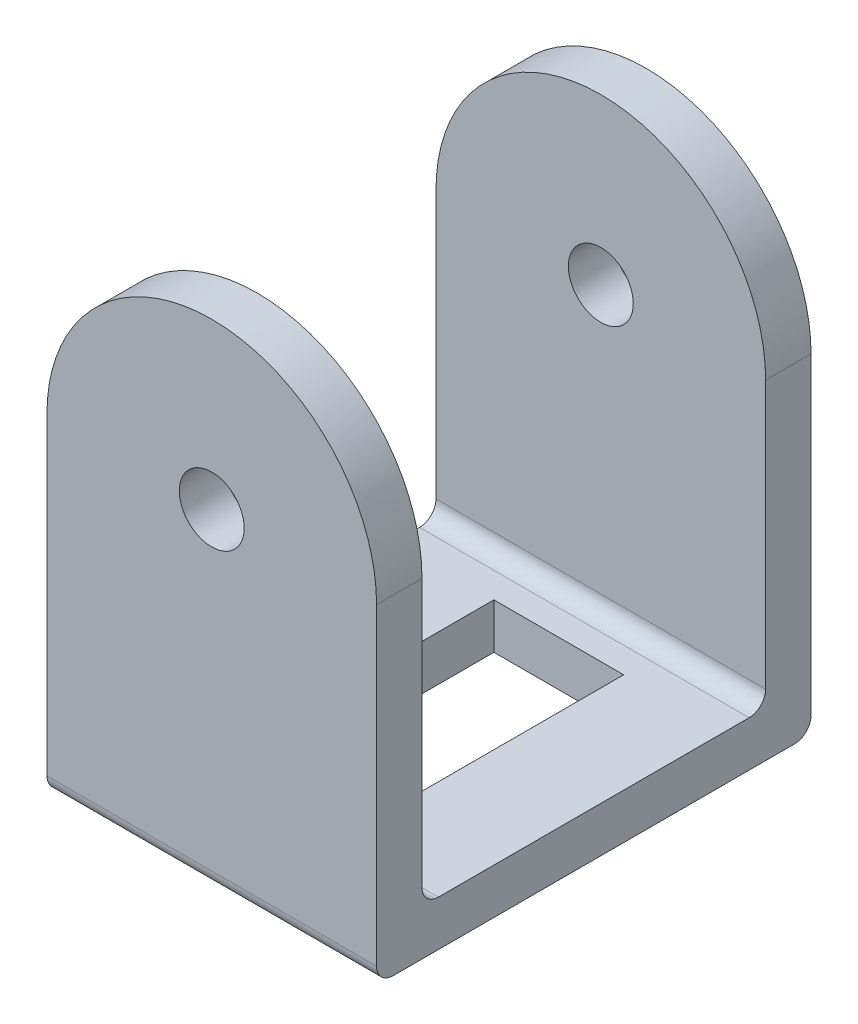
ISO-10303-21;
HEADER;
FILE_DESCRIPTION(('STEP AP214'),'2;1');
FILE_NAME('part.step','',(''),(''),'','','');
FILE_SCHEMA(('AUTOMOTIVE_DESIGN { 1 0 10303 214 1 1 1 1 }'));
ENDSEC;
DATA;
#1=APPLICATION_CONTEXT('core data for automotive mechanical design processes');
#2=APPLICATION_PROTOCOL_DEFINITION('international standard','automotive_design',2000,#1);
#3=PRODUCT_CONTEXT('',#1,'mechanical');
#4=PRODUCT('Part','Part','',(#3));
#5=PRODUCT_RELATED_PRODUCT_CATEGORY('part','',(#4));
#6=PRODUCT_DEFINITION_FORMATION('','',#4);
#7=PRODUCT_DEFINITION_CONTEXT('part definition',#1,'design');
#8=PRODUCT_DEFINITION('design','',#6,#7);
#9=PRODUCT_DEFINITION_SHAPE('','',#8);
#10=(LENGTH_UNIT() NAMED_UNIT(*) SI_UNIT(.MILLI.,.METRE.));
#11=(NAMED_UNIT(*) PLANE_ANGLE_UNIT() SI_UNIT($,.RADIAN.));
#12=(NAMED_UNIT(*) SI_UNIT($,.STERADIAN.) SOLID_ANGLE_UNIT());
#13=UNCERTAINTY_MEASURE_WITH_UNIT(LENGTH_MEASURE(1.E-05),#10,'distance_accuracy_value','');
#14=(GEOMETRIC_REPRESENTATION_CONTEXT(3) GLOBAL_UNCERTAINTY_ASSIGNED_CONTEXT((#13)) GLOBAL_UNIT_ASSIGNED_CONTEXT((#10,
#11,#12)) REPRESENTATION_CONTEXT('',''));
#15=CARTESIAN_POINT('',(0.,0.,0.));
#16=DIRECTION('',(0.,0.,1.));
#17=DIRECTION('',(1.,0.,0.));
#18=AXIS2_PLACEMENT_3D('',#15,#16,#17);
#19=CARTESIAN_POINT('',(0.,50.8,33.48));
#20=DIRECTION('',(0.,0.,1.));
#21=DIRECTION('',(1.,0.,0.));
#22=AXIS2_PLACEMENT_3D('',#19,#20,#21);
#23=CYLINDRICAL_SURFACE('',#22,25.4);
#24=DIRECTION('',(0.,0.,-1.));
#25=VECTOR('',#24,1.);
#26=CARTESIAN_POINT('',(-25.4,50.8,33.48));
#27=LINE('',#26,#25);
#28=CARTESIAN_POINT('',(-25.4,50.8,33.48));
#29=VERTEX_POINT('',#28);
#30=CARTESIAN_POINT('',(-25.4,50.8,26.48));
#31=VERTEX_POINT('',#30);
#32=EDGE_CURVE('E266',#29,#31,#27,.T.);
#33=ORIENTED_EDGE('',*,*,#32,.F.);
#34=CARTESIAN_POINT('',(0.,50.8,33.48));
#35=DIRECTION('',(0.,0.,-1.));
#36=DIRECTION('',(-1.,0.,0.));
#37=AXIS2_PLACEMENT_3D('',#34,#35,#36);
#38=CIRCLE('',#37,25.4);
#39=CARTESIAN_POINT('',(25.4,50.8,33.48));
#40=VERTEX_POINT('',#39);
#41=EDGE_CURVE('E274',#40,#29,#38,.F.);
#42=ORIENTED_EDGE('',*,*,#41,.F.);
#43=DIRECTION('',(0.,0.,-1.));
#44=VECTOR('',#43,1.);
#45=CARTESIAN_POINT('',(25.4,50.8,33.48));
#46=LINE('',#45,#44);
#47=CARTESIAN_POINT('',(25.4,50.8,26.48));
#48=VERTEX_POINT('',#47);
#49=EDGE_CURVE('E270',#48,#40,#46,.F.);
#50=ORIENTED_EDGE('',*,*,#49,.F.);
#51=CARTESIAN_POINT('',(0.,50.8,26.48));
#52=DIRECTION('',(0.,0.,1.));
#53=DIRECTION('',(1.,0.,0.));
#54=AXIS2_PLACEMENT_3D('',#51,#52,#53);
#55=CIRCLE('',#54,25.4);
#56=EDGE_CURVE('E277',#31,#48,#55,.F.);
#57=ORIENTED_EDGE('',*,*,#56,.F.);
#58=EDGE_LOOP('',(#33,#42,#50,#57));
#59=FACE_BOUND('',#58,.T.);
#60=ADVANCED_FACE('F47',(#59),#23,.T.);
#61=CARTESIAN_POINT('',(0.,50.8,-26.48));
#62=DIRECTION('',(0.,0.,1.));
#63=DIRECTION('',(1.,0.,0.));
#64=AXIS2_PLACEMENT_3D('',#61,#62,#63);
#65=CYLINDRICAL_SURFACE('',#64,25.4);
#66=DIRECTION('',(0.,0.,-1.));
#67=VECTOR('',#66,1.);
#68=CARTESIAN_POINT('',(-25.4,50.8,-26.48));
#69=LINE('',#68,#67);
#70=CARTESIAN_POINT('',(-25.4,50.8,-26.48));
#71=VERTEX_POINT('',#70);
#72=CARTESIAN_POINT('',(-25.4,50.8,-33.48));
#73=VERTEX_POINT('',#72);
#74=EDGE_CURVE('E252',#71,#73,#69,.T.);
#75=ORIENTED_EDGE('',*,*,#74,.F.);
#76=CARTESIAN_POINT('',(0.,50.8,-26.48));
#77=DIRECTION('',(0.,0.,-1.));
#78=DIRECTION('',(-1.,0.,0.));
#79=AXIS2_PLACEMENT_3D('',#76,#77,#78);
#80=CIRCLE('',#79,25.4);
#81=CARTESIAN_POINT('',(25.4,50.8,-26.48));
#82=VERTEX_POINT('',#81);
#83=EDGE_CURVE('E260',#82,#71,#80,.F.);
#84=ORIENTED_EDGE('',*,*,#83,.F.);
#85=DIRECTION('',(0.,0.,-1.));
#86=VECTOR('',#85,1.);
#87=CARTESIAN_POINT('',(25.4,50.8,-26.48));
#88=LINE('',#87,#86);
#89=CARTESIAN_POINT('',(25.4,50.8,-33.48));
#90=VERTEX_POINT('',#89);
#91=EDGE_CURVE('E256',#90,#82,#88,.F.);
#92=ORIENTED_EDGE('',*,*,#91,.F.);
#93=CARTESIAN_POINT('',(0.,50.8,-33.48));
#94=DIRECTION('',(0.,0.,1.));
#95=DIRECTION('',(1.,0.,0.));
#96=AXIS2_PLACEMENT_3D('',#93,#94,#95);
#97=CIRCLE('',#96,25.4);
#98=EDGE_CURVE('E263',#73,#90,#97,.F.);
#99=ORIENTED_EDGE('',*,*,#98,.F.);
#100=EDGE_LOOP('',(#75,#84,#92,#99));
#101=FACE_BOUND('',#100,.T.);
#102=ADVANCED_FACE('F421',(#101),#65,.T.);
#103=CARTESIAN_POINT('',(0.,7.,0.));
#104=DIRECTION('',(0.,1.,0.));
#105=DIRECTION('',(0.,0.,1.));
#106=AXIS2_PLACEMENT_3D('',#103,#104,#105);
#107=PLANE('',#106);
#108=DIRECTION('',(0.,0.,1.));
#109=VECTOR('',#108,1.);
#110=CARTESIAN_POINT('',(-10.,7.,20.));
#111=LINE('',#110,#109);
#112=CARTESIAN_POINT('',(-10.,7.,-20.));
#113=VERTEX_POINT('',#112);
#114=CARTESIAN_POINT('',(-10.,7.,20.));
#115=VERTEX_POINT('',#114);
#116=EDGE_CURVE('E168',#113,#115,#111,.T.);
#117=ORIENTED_EDGE('',*,*,#116,.F.);
#118=DIRECTION('',(-1.,0.,0.));
#119=VECTOR('',#118,1.);
#120=CARTESIAN_POINT('',(10.,7.,-20.));
#121=LINE('',#120,#119);
#122=CARTESIAN_POINT('',(10.,7.,-20.));
#123=VERTEX_POINT('',#122);
#124=EDGE_CURVE('E189',#123,#113,#121,.T.);
#125=ORIENTED_EDGE('',*,*,#124,.F.);
#126=DIRECTION('',(0.,0.,-1.));
#127=VECTOR('',#126,1.);
#128=CARTESIAN_POINT('',(10.,7.,20.));
#129=LINE('',#128,#127);
#130=CARTESIAN_POINT('',(10.,7.,20.));
#131=VERTEX_POINT('',#130);
#132=EDGE_CURVE('E194',#131,#123,#129,.T.);
#133=ORIENTED_EDGE('',*,*,#132,.F.);
#134=DIRECTION('',(1.,0.,0.));
#135=VECTOR('',#134,1.);
#136=CARTESIAN_POINT('',(10.,7.,20.));
#137=LINE('',#136,#135);
#138=EDGE_CURVE('E206',#115,#131,#137,.T.);
#139=ORIENTED_EDGE('',*,*,#138,.F.);
#140=EDGE_LOOP('',(#117,#125,#133,#139));
#141=FACE_BOUND('',#140,.T.);
#142=DIRECTION('',(0.,0.,1.));
#143=VECTOR('',#142,1.);
#144=CARTESIAN_POINT('',(-25.4,7.,33.48));
#145=LINE('',#144,#143);
#146=CARTESIAN_POINT('',(-25.4,7.,-23.94));
#147=VERTEX_POINT('',#146);
#148=CARTESIAN_POINT('',(-25.4,7.,23.94));
#149=VERTEX_POINT('',#148);
#150=EDGE_CURVE('E221',#147,#149,#145,.T.);
#151=ORIENTED_EDGE('',*,*,#150,.T.);
#152=DIRECTION('',(-1.,0.,0.));
#153=VECTOR('',#152,1.);
#154=CARTESIAN_POINT('',(0.,7.,23.94));
#155=LINE('',#154,#153);
#156=CARTESIAN_POINT('',(25.4,7.,23.94));
#157=VERTEX_POINT('',#156);
#158=EDGE_CURVE('E292',#149,#157,#155,.F.);
#159=ORIENTED_EDGE('',*,*,#158,.T.);
#160=DIRECTION('',(0.,0.,-1.));
#161=VECTOR('',#160,1.);
#162=CARTESIAN_POINT('',(25.4,7.,33.48));
#163=LINE('',#162,#161);
#164=CARTESIAN_POINT('',(25.4,7.,-23.94));
#165=VERTEX_POINT('',#164);
#166=EDGE_CURVE('E225',#157,#165,#163,.T.);
#167=ORIENTED_EDGE('',*,*,#166,.T.);
#168=DIRECTION('',(1.,0.,0.));
#169=VECTOR('',#168,1.);
#170=CARTESIAN_POINT('',(0.,7.,-23.94));
#171=LINE('',#170,#169);
#172=EDGE_CURVE('E289',#165,#147,#171,.F.);
#173=ORIENTED_EDGE('',*,*,#172,.T.);
#174=EDGE_LOOP('',(#151,#159,#167,#173));
#175=FACE_BOUND('',#174,.T.);
#176=ADVANCED_FACE('F337',(#141,#175),#107,.T.);
#177=CARTESIAN_POINT('',(-25.4,7.,33.48));
#178=DIRECTION('',(1.,0.,0.));
#179=DIRECTION('',(0.,0.,-1.));
#180=AXIS2_PLACEMENT_3D('',#177,#178,#179);
#181=PLANE('',#180);
#182=DIRECTION('',(0.,-1.,0.));
#183=VECTOR('',#182,1.);
#184=CARTESIAN_POINT('',(-25.4,7.,-33.48));
#185=LINE('',#184,#183);
#186=CARTESIAN_POINT('',(-25.4,2.54,-33.48));
#187=VERTEX_POINT('',#186);
#188=EDGE_CURVE('E230',#73,#187,#185,.T.);
#189=ORIENTED_EDGE('',*,*,#188,.T.);
#190=CARTESIAN_POINT('',(-25.4,2.54,-30.94));
#191=DIRECTION('',(1.,0.,0.));
#192=DIRECTION('',(0.,0.,-1.));
#193=AXIS2_PLACEMENT_3D('',#190,#191,#192);
#194=CIRCLE('',#193,2.54);
#195=CARTESIAN_POINT('',(-25.4,0.,-30.94));
#196=VERTEX_POINT('',#195);
#197=EDGE_CURVE('E302',#187,#196,#194,.F.);
#198=ORIENTED_EDGE('',*,*,#197,.T.);
#199=DIRECTION('',(0.,0.,1.));
#200=VECTOR('',#199,1.);
#201=CARTESIAN_POINT('',(-25.4,0.,33.48));
#202=LINE('',#201,#200);
#203=CARTESIAN_POINT('',(-25.4,0.,30.94));
#204=VERTEX_POINT('',#203);
#205=EDGE_CURVE('E215',#196,#204,#202,.T.);
#206=ORIENTED_EDGE('',*,*,#205,.T.);
#207=CARTESIAN_POINT('',(-25.4,2.54,30.94));
#208=DIRECTION('',(1.,0.,0.));
#209=DIRECTION('',(0.,0.,-1.));
#210=AXIS2_PLACEMENT_3D('',#207,#208,#209);
#211=CIRCLE('',#210,2.54);
#212=CARTESIAN_POINT('',(-25.4,2.54,33.48));
#213=VERTEX_POINT('',#212);
#214=EDGE_CURVE('E299',#204,#213,#211,.F.);
#215=ORIENTED_EDGE('',*,*,#214,.T.);
#216=DIRECTION('',(0.,-1.,0.));
#217=VECTOR('',#216,1.);
#218=CARTESIAN_POINT('',(-25.4,7.,33.48));
#219=LINE('',#218,#217);
#220=EDGE_CURVE('E248',#29,#213,#219,.T.);
#221=ORIENTED_EDGE('',*,*,#220,.F.);
#222=ORIENTED_EDGE('',*,*,#32,.T.);
#223=DIRECTION('',(0.,-1.,0.));
#224=VECTOR('',#223,1.);
#225=CARTESIAN_POINT('',(-25.4,76.2,26.48));
#226=LINE('',#225,#224);
#227=CARTESIAN_POINT('',(-25.4,9.54000000000001,26.48));
#228=VERTEX_POINT('',#227);
#229=EDGE_CURVE('E351',#31,#228,#226,.T.);
#230=ORIENTED_EDGE('',*,*,#229,.T.);
#231=CARTESIAN_POINT('',(-25.4,9.54000000000001,23.94));
#232=DIRECTION('',(1.,0.,0.));
#233=DIRECTION('',(0.,0.,-1.));
#234=AXIS2_PLACEMENT_3D('',#231,#232,#233);
#235=CIRCLE('',#234,2.54);
#236=EDGE_CURVE('E322',#228,#149,#235,.T.);
#237=ORIENTED_EDGE('',*,*,#236,.T.);
#238=ORIENTED_EDGE('',*,*,#150,.F.);
#239=CARTESIAN_POINT('',(-25.4,9.54000000000001,-23.94));
#240=DIRECTION('',(1.,0.,0.));
#241=DIRECTION('',(0.,0.,-1.));
#242=AXIS2_PLACEMENT_3D('',#239,#240,#241);
#243=CIRCLE('',#242,2.54);
#244=CARTESIAN_POINT('',(-25.4,9.54000000000001,-26.48));
#245=VERTEX_POINT('',#244);
#246=EDGE_CURVE('E11',#147,#245,#243,.T.);
#247=ORIENTED_EDGE('',*,*,#246,.T.);
#248=DIRECTION('',(0.,-1.,0.));
#249=VECTOR('',#248,1.);
#250=CARTESIAN_POINT('',(-25.4,76.2,-26.48));
#251=LINE('',#250,#249);
#252=EDGE_CURVE('E197',#71,#245,#251,.T.);
#253=ORIENTED_EDGE('',*,*,#252,.F.);
#254=ORIENTED_EDGE('',*,*,#74,.T.);
#255=EDGE_LOOP('',(#189,#198,#206,#215,#221,#222,#230,#237,#238,#247,#253,#254));
#256=FACE_BOUND('',#255,.T.);
#257=ADVANCED_FACE('F344',(#256),#181,.F.);
#258=CARTESIAN_POINT('',(25.4,7.,33.48));
#259=DIRECTION('',(0.,0.,-1.));
#260=DIRECTION('',(-1.,0.,0.));
#261=AXIS2_PLACEMENT_3D('',#258,#259,#260);
#262=PLANE('',#261);
#263=CARTESIAN_POINT('',(0.,50.8,33.48));
#264=DIRECTION('',(0.,0.,-1.));
#265=DIRECTION('',(-1.,0.,0.));
#266=AXIS2_PLACEMENT_3D('',#263,#264,#265);
#267=CIRCLE('',#266,5.);
#268=CARTESIAN_POINT('',(-5.,50.8,33.48));
#269=VERTEX_POINT('',#268);
#270=EDGE_CURVE('E361',#269,#269,#267,.T.);
#271=ORIENTED_EDGE('',*,*,#270,.T.);
#272=EDGE_LOOP('',(#271));
#273=FACE_BOUND('',#272,.T.);
#274=ORIENTED_EDGE('',*,*,#220,.T.);
#275=DIRECTION('',(1.,0.,0.));
#276=VECTOR('',#275,1.);
#277=CARTESIAN_POINT('',(25.4,2.54,33.48));
#278=LINE('',#277,#276);
#279=CARTESIAN_POINT('',(25.4,2.54,33.48));
#280=VERTEX_POINT('',#279);
#281=EDGE_CURVE('E316',#213,#280,#278,.T.);
#282=ORIENTED_EDGE('',*,*,#281,.T.);
#283=DIRECTION('',(0.,-1.,0.));
#284=VECTOR('',#283,1.);
#285=CARTESIAN_POINT('',(25.4,7.,33.48));
#286=LINE('',#285,#284);
#287=EDGE_CURVE('E244',#40,#280,#286,.T.);
#288=ORIENTED_EDGE('',*,*,#287,.F.);
#289=ORIENTED_EDGE('',*,*,#41,.T.);
#290=EDGE_LOOP('',(#274,#282,#288,#289));
#291=FACE_BOUND('',#290,.T.);
#292=ADVANCED_FACE('F401',(#273,#291),#262,.F.);
#293=CARTESIAN_POINT('',(25.4,7.,33.48));
#294=DIRECTION('',(-1.,0.,0.));
#295=DIRECTION('',(0.,0.,1.));
#296=AXIS2_PLACEMENT_3D('',#293,#294,#295);
#297=PLANE('',#296);
#298=DIRECTION('',(0.,0.,-1.));
#299=VECTOR('',#298,1.);
#300=CARTESIAN_POINT('',(25.4,0.,33.48));
#301=LINE('',#300,#299);
#302=CARTESIAN_POINT('',(25.4,0.,30.94));
#303=VERTEX_POINT('',#302);
#304=CARTESIAN_POINT('',(25.4,0.,-30.94));
#305=VERTEX_POINT('',#304);
#306=EDGE_CURVE('E226',#303,#305,#301,.T.);
#307=ORIENTED_EDGE('',*,*,#306,.T.);
#308=CARTESIAN_POINT('',(25.4,2.54,-30.94));
#309=DIRECTION('',(-1.,0.,0.));
#310=DIRECTION('',(0.,0.,1.));
#311=AXIS2_PLACEMENT_3D('',#308,#309,#310);
#312=CIRCLE('',#311,2.54);
#313=CARTESIAN_POINT('',(25.4,2.54,-33.48));
#314=VERTEX_POINT('',#313);
#315=EDGE_CURVE('E313',#305,#314,#312,.F.);
#316=ORIENTED_EDGE('',*,*,#315,.T.);
#317=DIRECTION('',(0.,-1.,0.));
#318=VECTOR('',#317,1.);
#319=CARTESIAN_POINT('',(25.4,7.,-33.48));
#320=LINE('',#319,#318);
#321=EDGE_CURVE('E240',#90,#314,#320,.T.);
#322=ORIENTED_EDGE('',*,*,#321,.F.);
#323=ORIENTED_EDGE('',*,*,#91,.T.);
#324=DIRECTION('',(0.,-1.,0.));
#325=VECTOR('',#324,1.);
#326=CARTESIAN_POINT('',(25.4,76.2,-26.48));
#327=LINE('',#326,#325);
#328=CARTESIAN_POINT('',(25.4,9.54000000000001,-26.48));
#329=VERTEX_POINT('',#328);
#330=EDGE_CURVE('E335',#82,#329,#327,.T.);
#331=ORIENTED_EDGE('',*,*,#330,.T.);
#332=CARTESIAN_POINT('',(25.4,9.54000000000001,-23.94));
#333=DIRECTION('',(-1.,0.,0.));
#334=DIRECTION('',(0.,0.,1.));
#335=AXIS2_PLACEMENT_3D('',#332,#333,#334);
#336=CIRCLE('',#335,2.54);
#337=EDGE_CURVE('E56',#329,#165,#336,.T.);
#338=ORIENTED_EDGE('',*,*,#337,.T.);
#339=ORIENTED_EDGE('',*,*,#166,.F.);
#340=CARTESIAN_POINT('',(25.4,9.54000000000001,23.94));
#341=DIRECTION('',(-1.,0.,0.));
#342=DIRECTION('',(0.,0.,1.));
#343=AXIS2_PLACEMENT_3D('',#340,#341,#342);
#344=CIRCLE('',#343,2.54);
#345=CARTESIAN_POINT('',(25.4,9.54000000000001,26.48));
#346=VERTEX_POINT('',#345);
#347=EDGE_CURVE('E325',#157,#346,#344,.T.);
#348=ORIENTED_EDGE('',*,*,#347,.T.);
#349=DIRECTION('',(0.,-1.,0.));
#350=VECTOR('',#349,1.);
#351=CARTESIAN_POINT('',(25.4,76.2,26.48));
#352=LINE('',#351,#350);
#353=EDGE_CURVE('E355',#48,#346,#352,.T.);
#354=ORIENTED_EDGE('',*,*,#353,.F.);
#355=ORIENTED_EDGE('',*,*,#49,.T.);
#356=ORIENTED_EDGE('',*,*,#287,.T.);
#357=CARTESIAN_POINT('',(25.4,2.54,30.94));
#358=DIRECTION('',(-1.,0.,0.));
#359=DIRECTION('',(0.,0.,1.));
#360=AXIS2_PLACEMENT_3D('',#357,#358,#359);
#361=CIRCLE('',#360,2.54);
#362=EDGE_CURVE('E70',#280,#303,#361,.F.);
#363=ORIENTED_EDGE('',*,*,#362,.T.);
#364=EDGE_LOOP('',(#307,#316,#322,#323,#331,#338,#339,#348,#354,#355,#356,#363));
#365=FACE_BOUND('',#364,.T.);
#366=ADVANCED_FACE('F332',(#365),#297,.F.);
#367=CARTESIAN_POINT('',(25.4,7.,-33.48));
#368=DIRECTION('',(0.,0.,1.));
#369=DIRECTION('',(1.,0.,0.));
#370=AXIS2_PLACEMENT_3D('',#367,#368,#369);
#371=PLANE('',#370);
#372=CARTESIAN_POINT('',(0.,50.8,-33.48));
#373=DIRECTION('',(0.,0.,1.));
#374=DIRECTION('',(1.,0.,0.));
#375=AXIS2_PLACEMENT_3D('',#372,#373,#374);
#376=CIRCLE('',#375,5.);
#377=CARTESIAN_POINT('',(5.,50.8,-33.48));
#378=VERTEX_POINT('',#377);
#379=EDGE_CURVE('E365',#378,#378,#376,.T.);
#380=ORIENTED_EDGE('',*,*,#379,.T.);
#381=EDGE_LOOP('',(#380));
#382=FACE_BOUND('',#381,.T.);
#383=ORIENTED_EDGE('',*,*,#321,.T.);
#384=DIRECTION('',(-1.,0.,0.));
#385=VECTOR('',#384,1.);
#386=CARTESIAN_POINT('',(25.4,2.54,-33.48));
#387=LINE('',#386,#385);
#388=EDGE_CURVE('E295',#314,#187,#387,.T.);
#389=ORIENTED_EDGE('',*,*,#388,.T.);
#390=ORIENTED_EDGE('',*,*,#188,.F.);
#391=ORIENTED_EDGE('',*,*,#98,.T.);
#392=EDGE_LOOP('',(#383,#389,#390,#391));
#393=FACE_BOUND('',#392,.T.);
#394=ADVANCED_FACE('F383',(#382,#393),#371,.F.);
#395=CARTESIAN_POINT('',(0.,0.,0.));
#396=DIRECTION('',(0.,1.,0.));
#397=DIRECTION('',(0.,0.,1.));
#398=AXIS2_PLACEMENT_3D('',#395,#396,#397);
#399=PLANE('',#398);
#400=DIRECTION('',(-1.,0.,0.));
#401=VECTOR('',#400,1.);
#402=CARTESIAN_POINT('',(10.,0.,-20.));
#403=LINE('',#402,#401);
#404=CARTESIAN_POINT('',(10.,0.,-20.));
#405=VERTEX_POINT('',#404);
#406=CARTESIAN_POINT('',(-10.,0.,-20.));
#407=VERTEX_POINT('',#406);
#408=EDGE_CURVE('E174',#405,#407,#403,.T.);
#409=ORIENTED_EDGE('',*,*,#408,.T.);
#410=DIRECTION('',(0.,0.,1.));
#411=VECTOR('',#410,1.);
#412=CARTESIAN_POINT('',(-10.,0.,20.));
#413=LINE('',#412,#411);
#414=CARTESIAN_POINT('',(-10.,0.,20.));
#415=VERTEX_POINT('',#414);
#416=EDGE_CURVE('E165',#407,#415,#413,.T.);
#417=ORIENTED_EDGE('',*,*,#416,.T.);
#418=DIRECTION('',(1.,0.,0.));
#419=VECTOR('',#418,1.);
#420=CARTESIAN_POINT('',(10.,0.,20.));
#421=LINE('',#420,#419);
#422=CARTESIAN_POINT('',(10.,0.,20.));
#423=VERTEX_POINT('',#422);
#424=EDGE_CURVE('E178',#415,#423,#421,.T.);
#425=ORIENTED_EDGE('',*,*,#424,.T.);
#426=DIRECTION('',(0.,0.,-1.));
#427=VECTOR('',#426,1.);
#428=CARTESIAN_POINT('',(10.,0.,20.));
#429=LINE('',#428,#427);
#430=EDGE_CURVE('E183',#423,#405,#429,.T.);
#431=ORIENTED_EDGE('',*,*,#430,.T.);
#432=EDGE_LOOP('',(#409,#417,#425,#431));
#433=FACE_BOUND('',#432,.T.);
#434=ORIENTED_EDGE('',*,*,#205,.F.);
#435=DIRECTION('',(-1.,0.,0.));
#436=VECTOR('',#435,1.);
#437=CARTESIAN_POINT('',(0.,0.,-30.94));
#438=LINE('',#437,#436);
#439=EDGE_CURVE('E308',#196,#305,#438,.F.);
#440=ORIENTED_EDGE('',*,*,#439,.T.);
#441=ORIENTED_EDGE('',*,*,#306,.F.);
#442=DIRECTION('',(1.,0.,0.));
#443=VECTOR('',#442,1.);
#444=CARTESIAN_POINT('',(0.,0.,30.94));
#445=LINE('',#444,#443);
#446=EDGE_CURVE('E305',#303,#204,#445,.F.);
#447=ORIENTED_EDGE('',*,*,#446,.T.);
#448=EDGE_LOOP('',(#434,#440,#441,#447));
#449=FACE_BOUND('',#448,.T.);
#450=ADVANCED_FACE('F185',(#433,#449),#399,.F.);
#451=CARTESIAN_POINT('',(-10.,0.,20.));
#452=DIRECTION('',(-1.,0.,0.));
#453=DIRECTION('',(0.,0.,1.));
#454=AXIS2_PLACEMENT_3D('',#451,#452,#453);
#455=PLANE('',#454);
#456=ORIENTED_EDGE('',*,*,#116,.T.);
#457=DIRECTION('',(0.,1.,0.));
#458=VECTOR('',#457,1.);
#459=CARTESIAN_POINT('',(-10.,0.,20.));
#460=LINE('',#459,#458);
#461=EDGE_CURVE('E161',#415,#115,#460,.T.);
#462=ORIENTED_EDGE('',*,*,#461,.F.);
#463=ORIENTED_EDGE('',*,*,#416,.F.);
#464=DIRECTION('',(0.,1.,0.));
#465=VECTOR('',#464,1.);
#466=CARTESIAN_POINT('',(-10.,0.,-20.));
#467=LINE('',#466,#465);
#468=EDGE_CURVE('E212',#407,#113,#467,.T.);
#469=ORIENTED_EDGE('',*,*,#468,.T.);
#470=EDGE_LOOP('',(#456,#462,#463,#469));
#471=FACE_BOUND('',#470,.T.);
#472=ADVANCED_FACE('F163',(#471),#455,.F.);
#473=CARTESIAN_POINT('',(10.,0.,-20.));
#474=DIRECTION('',(0.,0.,-1.));
#475=DIRECTION('',(-1.,0.,0.));
#476=AXIS2_PLACEMENT_3D('',#473,#474,#475);
#477=PLANE('',#476);
#478=ORIENTED_EDGE('',*,*,#124,.T.);
#479=ORIENTED_EDGE('',*,*,#468,.F.);
#480=ORIENTED_EDGE('',*,*,#408,.F.);
#481=DIRECTION('',(0.,1.,0.));
#482=VECTOR('',#481,1.);
#483=CARTESIAN_POINT('',(10.,0.,-20.));
#484=LINE('',#483,#482);
#485=EDGE_CURVE('E216',#405,#123,#484,.T.);
#486=ORIENTED_EDGE('',*,*,#485,.T.);
#487=EDGE_LOOP('',(#478,#479,#480,#486));
#488=FACE_BOUND('',#487,.T.);
#489=ADVANCED_FACE('F449',(#488),#477,.F.);
#490=CARTESIAN_POINT('',(10.,0.,20.));
#491=DIRECTION('',(1.,0.,0.));
#492=DIRECTION('',(0.,0.,-1.));
#493=AXIS2_PLACEMENT_3D('',#490,#491,#492);
#494=PLANE('',#493);
#495=ORIENTED_EDGE('',*,*,#132,.T.);
#496=ORIENTED_EDGE('',*,*,#485,.F.);
#497=ORIENTED_EDGE('',*,*,#430,.F.);
#498=DIRECTION('',(0.,1.,0.));
#499=VECTOR('',#498,1.);
#500=CARTESIAN_POINT('',(10.,0.,20.));
#501=LINE('',#500,#499);
#502=EDGE_CURVE('E173',#423,#131,#501,.T.);
#503=ORIENTED_EDGE('',*,*,#502,.T.);
#504=EDGE_LOOP('',(#495,#496,#497,#503));
#505=FACE_BOUND('',#504,.T.);
#506=ADVANCED_FACE('F452',(#505),#494,.F.);
#507=CARTESIAN_POINT('',(10.,0.,20.));
#508=DIRECTION('',(0.,0.,1.));
#509=DIRECTION('',(1.,0.,0.));
#510=AXIS2_PLACEMENT_3D('',#507,#508,#509);
#511=PLANE('',#510);
#512=ORIENTED_EDGE('',*,*,#138,.T.);
#513=ORIENTED_EDGE('',*,*,#502,.F.);
#514=ORIENTED_EDGE('',*,*,#424,.F.);
#515=ORIENTED_EDGE('',*,*,#461,.T.);
#516=EDGE_LOOP('',(#512,#513,#514,#515));
#517=FACE_BOUND('',#516,.T.);
#518=ADVANCED_FACE('F179',(#517),#511,.F.);
#519=CARTESIAN_POINT('',(-25.4,76.2,-26.48));
#520=DIRECTION('',(0.,0.,-1.));
#521=DIRECTION('',(-1.,0.,0.));
#522=AXIS2_PLACEMENT_3D('',#519,#520,#521);
#523=PLANE('',#522);
#524=CARTESIAN_POINT('',(0.,50.8,-26.48));
#525=DIRECTION('',(0.,0.,-1.));
#526=DIRECTION('',(-1.,0.,0.));
#527=AXIS2_PLACEMENT_3D('',#524,#525,#526);
#528=CIRCLE('',#527,5.);
#529=CARTESIAN_POINT('',(-5.,50.8,-26.48));
#530=VERTEX_POINT('',#529);
#531=EDGE_CURVE('E285',#530,#530,#528,.T.);
#532=ORIENTED_EDGE('',*,*,#531,.T.);
#533=EDGE_LOOP('',(#532));
#534=FACE_BOUND('',#533,.T.);
#535=ORIENTED_EDGE('',*,*,#252,.T.);
#536=DIRECTION('',(1.,0.,0.));
#537=VECTOR('',#536,1.);
#538=CARTESIAN_POINT('',(-25.4,9.54000000000001,-26.48));
#539=LINE('',#538,#537);
#540=EDGE_CURVE('E319',#245,#329,#539,.T.);
#541=ORIENTED_EDGE('',*,*,#540,.T.);
#542=ORIENTED_EDGE('',*,*,#330,.F.);
#543=ORIENTED_EDGE('',*,*,#83,.T.);
#544=EDGE_LOOP('',(#535,#541,#542,#543));
#545=FACE_BOUND('',#544,.T.);
#546=ADVANCED_FACE('F346',(#534,#545),#523,.F.);
#547=CARTESIAN_POINT('',(25.4,76.2,26.48));
#548=DIRECTION('',(0.,0.,1.));
#549=DIRECTION('',(1.,0.,0.));
#550=AXIS2_PLACEMENT_3D('',#547,#548,#549);
#551=PLANE('',#550);
#552=CARTESIAN_POINT('',(0.,50.8,26.48));
#553=DIRECTION('',(0.,0.,1.));
#554=DIRECTION('',(1.,0.,0.));
#555=AXIS2_PLACEMENT_3D('',#552,#553,#554);
#556=CIRCLE('',#555,5.);
#557=CARTESIAN_POINT('',(5.,50.8,26.48));
#558=VERTEX_POINT('',#557);
#559=EDGE_CURVE('E281',#558,#558,#556,.T.);
#560=ORIENTED_EDGE('',*,*,#559,.T.);
#561=EDGE_LOOP('',(#560));
#562=FACE_BOUND('',#561,.T.);
#563=ORIENTED_EDGE('',*,*,#353,.T.);
#564=DIRECTION('',(-1.,0.,0.));
#565=VECTOR('',#564,1.);
#566=CARTESIAN_POINT('',(25.4,9.54000000000001,26.48));
#567=LINE('',#566,#565);
#568=EDGE_CURVE('E280',#346,#228,#567,.T.);
#569=ORIENTED_EDGE('',*,*,#568,.T.);
#570=ORIENTED_EDGE('',*,*,#229,.F.);
#571=ORIENTED_EDGE('',*,*,#56,.T.);
#572=EDGE_LOOP('',(#563,#569,#570,#571));
#573=FACE_BOUND('',#572,.T.);
#574=ADVANCED_FACE('F408',(#562,#573),#551,.F.);
#575=CARTESIAN_POINT('',(0.,50.8,-426.48));
#576=DIRECTION('',(0.,0.,1.));
#577=DIRECTION('',(1.,0.,0.));
#578=AXIS2_PLACEMENT_3D('',#575,#576,#577);
#579=CYLINDRICAL_SURFACE('',#578,5.);
#580=ORIENTED_EDGE('',*,*,#559,.F.);
#581=EDGE_LOOP('',(#580));
#582=FACE_BOUND('',#581,.T.);
#583=ORIENTED_EDGE('',*,*,#270,.F.);
#584=EDGE_LOOP('',(#583));
#585=FACE_BOUND('',#584,.T.);
#586=ADVANCED_FACE('F379',(#582,#585),#579,.F.);
#587=ORIENTED_EDGE('',*,*,#531,.F.);
#588=EDGE_LOOP('',(#587));
#589=FACE_BOUND('',#588,.T.);
#590=ORIENTED_EDGE('',*,*,#379,.F.);
#591=EDGE_LOOP('',(#590));
#592=FACE_BOUND('',#591,.T.);
#593=ADVANCED_FACE('F375',(#589,#592),#579,.F.);
#594=CARTESIAN_POINT('',(25.4,9.54000000000001,23.94));
#595=DIRECTION('',(-1.,0.,0.));
#596=DIRECTION('',(0.,0.,1.));
#597=AXIS2_PLACEMENT_3D('',#594,#595,#596);
#598=CYLINDRICAL_SURFACE('',#597,2.54);
#599=ORIENTED_EDGE('',*,*,#347,.F.);
#600=ORIENTED_EDGE('',*,*,#158,.F.);
#601=ORIENTED_EDGE('',*,*,#236,.F.);
#602=ORIENTED_EDGE('',*,*,#568,.F.);
#603=EDGE_LOOP('',(#599,#600,#601,#602));
#604=FACE_BOUND('',#603,.T.);
#605=ADVANCED_FACE('F378',(#604),#598,.F.);
#606=CARTESIAN_POINT('',(25.4,2.54,-30.94));
#607=DIRECTION('',(-1.,0.,0.));
#608=DIRECTION('',(0.,0.,1.));
#609=AXIS2_PLACEMENT_3D('',#606,#607,#608);
#610=CYLINDRICAL_SURFACE('',#609,2.54);
#611=ORIENTED_EDGE('',*,*,#315,.F.);
#612=ORIENTED_EDGE('',*,*,#439,.F.);
#613=ORIENTED_EDGE('',*,*,#197,.F.);
#614=ORIENTED_EDGE('',*,*,#388,.F.);
#615=EDGE_LOOP('',(#611,#612,#613,#614));
#616=FACE_BOUND('',#615,.T.);
#617=ADVANCED_FACE('F393',(#616),#610,.T.);
#618=CARTESIAN_POINT('',(25.4,2.54,30.94));
#619=DIRECTION('',(1.,0.,0.));
#620=DIRECTION('',(0.,0.,-1.));
#621=AXIS2_PLACEMENT_3D('',#618,#619,#620);
#622=CYLINDRICAL_SURFACE('',#621,2.54);
#623=ORIENTED_EDGE('',*,*,#214,.F.);
#624=ORIENTED_EDGE('',*,*,#446,.F.);
#625=ORIENTED_EDGE('',*,*,#362,.F.);
#626=ORIENTED_EDGE('',*,*,#281,.F.);
#627=EDGE_LOOP('',(#623,#624,#625,#626));
#628=FACE_BOUND('',#627,.T.);
#629=ADVANCED_FACE('F398',(#628),#622,.T.);
#630=CARTESIAN_POINT('',(-25.4,9.54000000000001,-23.94));
#631=DIRECTION('',(1.,0.,0.));
#632=DIRECTION('',(0.,0.,-1.));
#633=AXIS2_PLACEMENT_3D('',#630,#631,#632);
#634=CYLINDRICAL_SURFACE('',#633,2.54);
#635=ORIENTED_EDGE('',*,*,#246,.F.);
#636=ORIENTED_EDGE('',*,*,#172,.F.);
#637=ORIENTED_EDGE('',*,*,#337,.F.);
#638=ORIENTED_EDGE('',*,*,#540,.F.);
#639=EDGE_LOOP('',(#635,#636,#637,#638));
#640=FACE_BOUND('',#639,.T.);
#641=ADVANCED_FACE('F49',(#640),#634,.F.);
#642=CLOSED_SHELL('',(#60,#102,#176,#257,#292,#366,#394,#450,#472,#489,#506,#518,#546,#574,#586,
#593,#605,#617,#629,#641));
#643=MANIFOLD_SOLID_BREP('B2',#642);
#644=ADVANCED_BREP_SHAPE_REPRESENTATION('',(#18,#643),#14);
#645=SHAPE_DEFINITION_REPRESENTATION(#9,#644);
ENDSEC;
END-ISO-10303-21;
